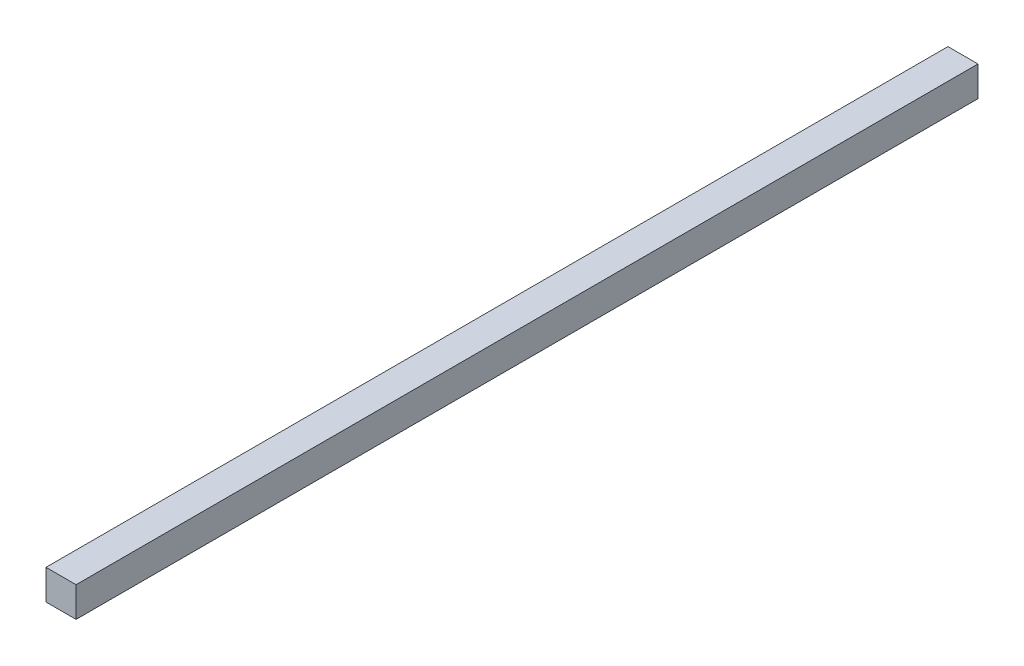
ISO-10303-21;
HEADER;
FILE_DESCRIPTION(('STEP AP214'),'2;1');
FILE_NAME('part.step','',(''),(''),'','','');
FILE_SCHEMA(('AUTOMOTIVE_DESIGN { 1 0 10303 214 1 1 1 1 }'));
ENDSEC;
DATA;
#1=APPLICATION_CONTEXT('core data for automotive mechanical design processes');
#2=APPLICATION_PROTOCOL_DEFINITION('international standard','automotive_design',2000,#1);
#3=PRODUCT_CONTEXT('',#1,'mechanical');
#4=PRODUCT('Part','Part','',(#3));
#5=PRODUCT_RELATED_PRODUCT_CATEGORY('part','',(#4));
#6=PRODUCT_DEFINITION_FORMATION('','',#4);
#7=PRODUCT_DEFINITION_CONTEXT('part definition',#1,'design');
#8=PRODUCT_DEFINITION('design','',#6,#7);
#9=PRODUCT_DEFINITION_SHAPE('','',#8);
#10=(LENGTH_UNIT() NAMED_UNIT(*) SI_UNIT(.MILLI.,.METRE.));
#11=(NAMED_UNIT(*) PLANE_ANGLE_UNIT() SI_UNIT($,.RADIAN.));
#12=(NAMED_UNIT(*) SI_UNIT($,.STERADIAN.) SOLID_ANGLE_UNIT());
#13=UNCERTAINTY_MEASURE_WITH_UNIT(LENGTH_MEASURE(1.E-05),#10,'distance_accuracy_value','');
#14=(GEOMETRIC_REPRESENTATION_CONTEXT(3) GLOBAL_UNCERTAINTY_ASSIGNED_CONTEXT((#13)) GLOBAL_UNIT_ASSIGNED_CONTEXT((#10,
#11,#12)) REPRESENTATION_CONTEXT('',''));
#15=CARTESIAN_POINT('',(0.,0.,0.));
#16=DIRECTION('',(0.,0.,1.));
#17=DIRECTION('',(1.,0.,0.));
#18=AXIS2_PLACEMENT_3D('',#15,#16,#17);
#19=CARTESIAN_POINT('',(0.,0.,-6000.));
#20=DIRECTION('',(1.,0.,0.));
#21=DIRECTION('',(0.,1.,0.));
#22=AXIS2_PLACEMENT_3D('',#19,#20,#21);
#23=PLANE('',#22);
#24=DIRECTION('',(0.,1.,0.));
#25=VECTOR('',#24,1.);
#26=CARTESIAN_POINT('',(0.,0.,0.));
#27=LINE('',#26,#25);
#28=CARTESIAN_POINT('',(0.,0.,0.));
#29=VERTEX_POINT('',#28);
#30=CARTESIAN_POINT('',(0.,200.,0.));
#31=VERTEX_POINT('',#30);
#32=EDGE_CURVE('E104',#29,#31,#27,.T.);
#33=ORIENTED_EDGE('',*,*,#32,.F.);
#34=DIRECTION('',(0.,0.,1.));
#35=VECTOR('',#34,1.);
#36=CARTESIAN_POINT('',(0.,0.,-6000.));
#37=LINE('',#36,#35);
#38=CARTESIAN_POINT('',(0.,0.,-6000.));
#39=VERTEX_POINT('',#38);
#40=EDGE_CURVE('E11',#39,#29,#37,.T.);
#41=ORIENTED_EDGE('',*,*,#40,.F.);
#42=DIRECTION('',(0.,1.,0.));
#43=VECTOR('',#42,1.);
#44=CARTESIAN_POINT('',(0.,0.,-6000.));
#45=LINE('',#44,#43);
#46=CARTESIAN_POINT('',(0.,200.,-6000.));
#47=VERTEX_POINT('',#46);
#48=EDGE_CURVE('E100',#39,#47,#45,.T.);
#49=ORIENTED_EDGE('',*,*,#48,.T.);
#50=DIRECTION('',(0.,0.,1.));
#51=VECTOR('',#50,1.);
#52=CARTESIAN_POINT('',(0.,200.,-6000.));
#53=LINE('',#52,#51);
#54=EDGE_CURVE('E45',#47,#31,#53,.T.);
#55=ORIENTED_EDGE('',*,*,#54,.T.);
#56=EDGE_LOOP('',(#33,#41,#49,#55));
#57=FACE_BOUND('',#56,.T.);
#58=ADVANCED_FACE('F39',(#57),#23,.T.);
#59=CARTESIAN_POINT('',(0.,0.,-6000.));
#60=DIRECTION('',(0.,-1.,0.));
#61=DIRECTION('',(0.,0.,-1.));
#62=AXIS2_PLACEMENT_3D('',#59,#60,#61);
#63=PLANE('',#62);
#64=DIRECTION('',(1.,0.,0.));
#65=VECTOR('',#64,1.);
#66=CARTESIAN_POINT('',(0.,0.,0.));
#67=LINE('',#66,#65);
#68=CARTESIAN_POINT('',(-200.,0.,0.));
#69=VERTEX_POINT('',#68);
#70=EDGE_CURVE('E98',#69,#29,#67,.T.);
#71=ORIENTED_EDGE('',*,*,#70,.F.);
#72=DIRECTION('',(0.,0.,1.));
#73=VECTOR('',#72,1.);
#74=CARTESIAN_POINT('',(-200.,0.,-6000.));
#75=LINE('',#74,#73);
#76=CARTESIAN_POINT('',(-200.,0.,-6000.));
#77=VERTEX_POINT('',#76);
#78=EDGE_CURVE('E48',#77,#69,#75,.T.);
#79=ORIENTED_EDGE('',*,*,#78,.F.);
#80=DIRECTION('',(1.,0.,0.));
#81=VECTOR('',#80,1.);
#82=CARTESIAN_POINT('',(0.,0.,-6000.));
#83=LINE('',#82,#81);
#84=EDGE_CURVE('E92',#77,#39,#83,.T.);
#85=ORIENTED_EDGE('',*,*,#84,.T.);
#86=ORIENTED_EDGE('',*,*,#40,.T.);
#87=EDGE_LOOP('',(#71,#79,#85,#86));
#88=FACE_BOUND('',#87,.T.);
#89=ADVANCED_FACE('F111',(#88),#63,.T.);
#90=CARTESIAN_POINT('',(-200.,0.,-6000.));
#91=DIRECTION('',(-1.,0.,0.));
#92=DIRECTION('',(0.,0.,1.));
#93=AXIS2_PLACEMENT_3D('',#90,#91,#92);
#94=PLANE('',#93);
#95=DIRECTION('',(0.,-1.,0.));
#96=VECTOR('',#95,1.);
#97=CARTESIAN_POINT('',(-200.,0.,0.));
#98=LINE('',#97,#96);
#99=CARTESIAN_POINT('',(-200.,200.,0.));
#100=VERTEX_POINT('',#99);
#101=EDGE_CURVE('E87',#100,#69,#98,.T.);
#102=ORIENTED_EDGE('',*,*,#101,.F.);
#103=DIRECTION('',(0.,0.,1.));
#104=VECTOR('',#103,1.);
#105=CARTESIAN_POINT('',(-200.,200.,-6000.));
#106=LINE('',#105,#104);
#107=CARTESIAN_POINT('',(-200.,200.,-6000.));
#108=VERTEX_POINT('',#107);
#109=EDGE_CURVE('E84',#108,#100,#106,.T.);
#110=ORIENTED_EDGE('',*,*,#109,.F.);
#111=DIRECTION('',(0.,-1.,0.));
#112=VECTOR('',#111,1.);
#113=CARTESIAN_POINT('',(-200.,0.,-6000.));
#114=LINE('',#113,#112);
#115=EDGE_CURVE('E90',#108,#77,#114,.T.);
#116=ORIENTED_EDGE('',*,*,#115,.T.);
#117=ORIENTED_EDGE('',*,*,#78,.T.);
#118=EDGE_LOOP('',(#102,#110,#116,#117));
#119=FACE_BOUND('',#118,.T.);
#120=ADVANCED_FACE('F86',(#119),#94,.T.);
#121=CARTESIAN_POINT('',(0.,200.,-6000.));
#122=DIRECTION('',(0.,1.,0.));
#123=DIRECTION('',(-1.,0.,0.));
#124=AXIS2_PLACEMENT_3D('',#121,#122,#123);
#125=PLANE('',#124);
#126=DIRECTION('',(-1.,0.,0.));
#127=VECTOR('',#126,1.);
#128=CARTESIAN_POINT('',(0.,200.,0.));
#129=LINE('',#128,#127);
#130=EDGE_CURVE('E106',#31,#100,#129,.T.);
#131=ORIENTED_EDGE('',*,*,#130,.F.);
#132=ORIENTED_EDGE('',*,*,#54,.F.);
#133=DIRECTION('',(-1.,0.,0.));
#134=VECTOR('',#133,1.);
#135=CARTESIAN_POINT('',(0.,200.,-6000.));
#136=LINE('',#135,#134);
#137=EDGE_CURVE('E93',#47,#108,#136,.T.);
#138=ORIENTED_EDGE('',*,*,#137,.T.);
#139=ORIENTED_EDGE('',*,*,#109,.T.);
#140=EDGE_LOOP('',(#131,#132,#138,#139));
#141=FACE_BOUND('',#140,.T.);
#142=ADVANCED_FACE('F96',(#141),#125,.T.);
#143=CARTESIAN_POINT('',(0.,0.,-6000.));
#144=DIRECTION('',(0.,0.,1.));
#145=DIRECTION('',(1.,0.,0.));
#146=AXIS2_PLACEMENT_3D('',#143,#144,#145);
#147=PLANE('',#146);
#148=ORIENTED_EDGE('',*,*,#48,.F.);
#149=ORIENTED_EDGE('',*,*,#84,.F.);
#150=ORIENTED_EDGE('',*,*,#115,.F.);
#151=ORIENTED_EDGE('',*,*,#137,.F.);
#152=EDGE_LOOP('',(#148,#149,#150,#151));
#153=FACE_BOUND('',#152,.T.);
#154=ADVANCED_FACE('F95',(#153),#147,.F.);
#155=CARTESIAN_POINT('',(0.,0.,0.));
#156=DIRECTION('',(0.,0.,1.));
#157=DIRECTION('',(1.,0.,0.));
#158=AXIS2_PLACEMENT_3D('',#155,#156,#157);
#159=PLANE('',#158);
#160=ORIENTED_EDGE('',*,*,#32,.T.);
#161=ORIENTED_EDGE('',*,*,#130,.T.);
#162=ORIENTED_EDGE('',*,*,#101,.T.);
#163=ORIENTED_EDGE('',*,*,#70,.T.);
#164=EDGE_LOOP('',(#160,#161,#162,#163));
#165=FACE_BOUND('',#164,.T.);
#166=ADVANCED_FACE('F115',(#165),#159,.T.);
#167=CLOSED_SHELL('',(#58,#89,#120,#142,#154,#166));
#168=MANIFOLD_SOLID_BREP('B2',#167);
#169=ADVANCED_BREP_SHAPE_REPRESENTATION('',(#18,#168),#14);
#170=SHAPE_DEFINITION_REPRESENTATION(#9,#169);
ENDSEC;
END-ISO-10303-21;
